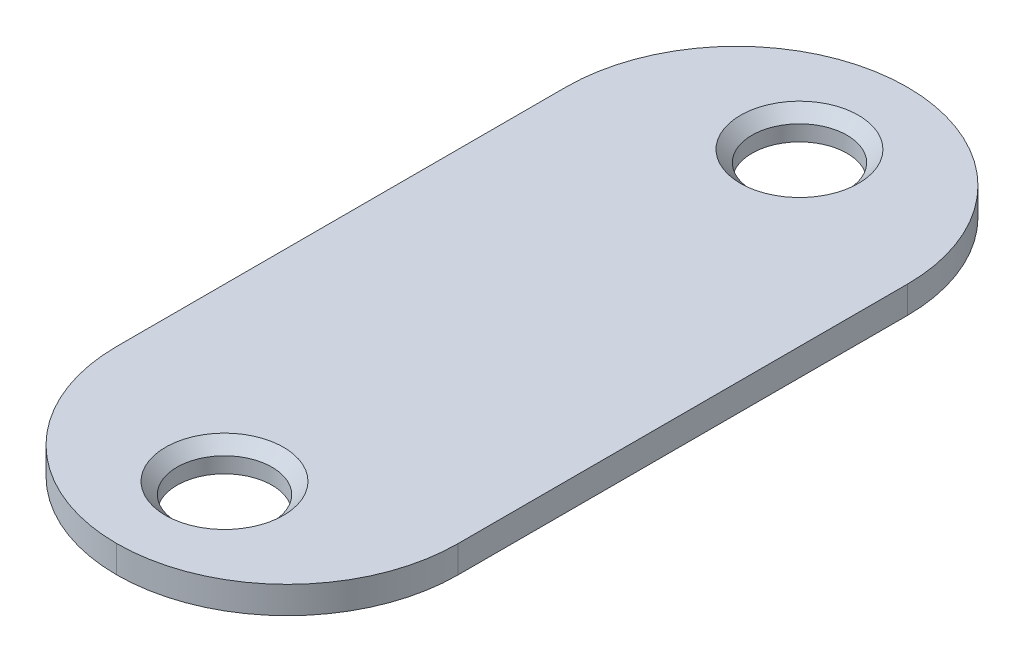
ISO-10303-21;
HEADER;
FILE_DESCRIPTION(('STEP AP214'),'2;1');
FILE_NAME('part.step','',(''),(''),'','','');
FILE_SCHEMA(('AUTOMOTIVE_DESIGN { 1 0 10303 214 1 1 1 1 }'));
ENDSEC;
DATA;
#1=APPLICATION_CONTEXT('core data for automotive mechanical design processes');
#2=APPLICATION_PROTOCOL_DEFINITION('international standard','automotive_design',2000,#1);
#3=PRODUCT_CONTEXT('',#1,'mechanical');
#4=PRODUCT('Part','Part','',(#3));
#5=PRODUCT_RELATED_PRODUCT_CATEGORY('part','',(#4));
#6=PRODUCT_DEFINITION_FORMATION('','',#4);
#7=PRODUCT_DEFINITION_CONTEXT('part definition',#1,'design');
#8=PRODUCT_DEFINITION('design','',#6,#7);
#9=PRODUCT_DEFINITION_SHAPE('','',#8);
#10=(LENGTH_UNIT() NAMED_UNIT(*) SI_UNIT(.MILLI.,.METRE.));
#11=(NAMED_UNIT(*) PLANE_ANGLE_UNIT() SI_UNIT($,.RADIAN.));
#12=(NAMED_UNIT(*) SI_UNIT($,.STERADIAN.) SOLID_ANGLE_UNIT());
#13=UNCERTAINTY_MEASURE_WITH_UNIT(LENGTH_MEASURE(1.E-05),#10,'distance_accuracy_value','');
#14=(GEOMETRIC_REPRESENTATION_CONTEXT(3) GLOBAL_UNCERTAINTY_ASSIGNED_CONTEXT((#13)) GLOBAL_UNIT_ASSIGNED_CONTEXT((#10,
#11,#12)) REPRESENTATION_CONTEXT('',''));
#15=CARTESIAN_POINT('',(0.,0.,0.));
#16=DIRECTION('',(0.,0.,1.));
#17=DIRECTION('',(1.,0.,0.));
#18=AXIS2_PLACEMENT_3D('',#15,#16,#17);
#19=CARTESIAN_POINT('',(-7.540625,1.2,-17.4625));
#20=DIRECTION('',(1.,0.,0.));
#21=DIRECTION('',(0.,0.,-1.));
#22=AXIS2_PLACEMENT_3D('',#19,#20,#21);
#23=PLANE('',#22);
#24=DIRECTION('',(0.,0.,1.));
#25=VECTOR('',#24,1.);
#26=CARTESIAN_POINT('',(-7.540625,0.,-17.4625));
#27=LINE('',#26,#25);
#28=CARTESIAN_POINT('',(-7.540625,0.,-9.921875));
#29=VERTEX_POINT('',#28);
#30=CARTESIAN_POINT('',(-7.540625,0.,9.921875));
#31=VERTEX_POINT('',#30);
#32=EDGE_CURVE('E96',#29,#31,#27,.T.);
#33=ORIENTED_EDGE('',*,*,#32,.T.);
#34=DIRECTION('',(0.,-1.,0.));
#35=VECTOR('',#34,1.);
#36=CARTESIAN_POINT('',(-7.540625,1.2,9.921875));
#37=LINE('',#36,#35);
#38=CARTESIAN_POINT('',(-7.540625,1.2,9.921875));
#39=VERTEX_POINT('',#38);
#40=EDGE_CURVE('E11',#31,#39,#37,.F.);
#41=ORIENTED_EDGE('',*,*,#40,.T.);
#42=DIRECTION('',(0.,0.,1.));
#43=VECTOR('',#42,1.);
#44=CARTESIAN_POINT('',(-7.540625,1.2,-17.4625));
#45=LINE('',#44,#43);
#46=CARTESIAN_POINT('',(-7.540625,1.2,-9.921875));
#47=VERTEX_POINT('',#46);
#48=EDGE_CURVE('E97',#47,#39,#45,.T.);
#49=ORIENTED_EDGE('',*,*,#48,.F.);
#50=DIRECTION('',(0.,-1.,0.));
#51=VECTOR('',#50,1.);
#52=CARTESIAN_POINT('',(-7.540625,1.2,-9.921875));
#53=LINE('',#52,#51);
#54=EDGE_CURVE('E90',#47,#29,#53,.T.);
#55=ORIENTED_EDGE('',*,*,#54,.T.);
#56=EDGE_LOOP('',(#33,#41,#49,#55));
#57=FACE_BOUND('',#56,.T.);
#58=ADVANCED_FACE('F31',(#57),#23,.F.);
#59=CARTESIAN_POINT('',(7.540625,1.2,-17.4625));
#60=DIRECTION('',(-1.,0.,0.));
#61=DIRECTION('',(0.,0.,1.));
#62=AXIS2_PLACEMENT_3D('',#59,#60,#61);
#63=PLANE('',#62);
#64=DIRECTION('',(0.,0.,-1.));
#65=VECTOR('',#64,1.);
#66=CARTESIAN_POINT('',(7.540625,1.2,-17.4625));
#67=LINE('',#66,#65);
#68=CARTESIAN_POINT('',(7.540625,1.2,9.921875));
#69=VERTEX_POINT('',#68);
#70=CARTESIAN_POINT('',(7.540625,1.2,-9.921875));
#71=VERTEX_POINT('',#70);
#72=EDGE_CURVE('E113',#69,#71,#67,.T.);
#73=ORIENTED_EDGE('',*,*,#72,.F.);
#74=DIRECTION('',(0.,-1.,0.));
#75=VECTOR('',#74,1.);
#76=CARTESIAN_POINT('',(7.540625,1.2,9.921875));
#77=LINE('',#76,#75);
#78=CARTESIAN_POINT('',(7.540625,0.,9.921875));
#79=VERTEX_POINT('',#78);
#80=EDGE_CURVE('E134',#69,#79,#77,.T.);
#81=ORIENTED_EDGE('',*,*,#80,.T.);
#82=DIRECTION('',(0.,0.,-1.));
#83=VECTOR('',#82,1.);
#84=CARTESIAN_POINT('',(7.540625,0.,-17.4625));
#85=LINE('',#84,#83);
#86=CARTESIAN_POINT('',(7.540625,0.,-9.921875));
#87=VERTEX_POINT('',#86);
#88=EDGE_CURVE('E104',#79,#87,#85,.T.);
#89=ORIENTED_EDGE('',*,*,#88,.T.);
#90=DIRECTION('',(0.,-1.,0.));
#91=VECTOR('',#90,1.);
#92=CARTESIAN_POINT('',(7.540625,1.2,-9.921875));
#93=LINE('',#92,#91);
#94=EDGE_CURVE('E132',#87,#71,#93,.F.);
#95=ORIENTED_EDGE('',*,*,#94,.T.);
#96=EDGE_LOOP('',(#73,#81,#89,#95));
#97=FACE_BOUND('',#96,.T.);
#98=ADVANCED_FACE('F154',(#97),#63,.F.);
#99=CARTESIAN_POINT('',(-7.540625,1.2,17.4625));
#100=DIRECTION('',(0.,1.,0.));
#101=DIRECTION('',(0.,0.,1.));
#102=AXIS2_PLACEMENT_3D('',#99,#100,#101);
#103=PLANE('',#102);
#104=CARTESIAN_POINT('',(0.,1.2,12.7));
#105=DIRECTION('',(0.,1.,0.));
#106=DIRECTION('',(0.,0.,1.));
#107=AXIS2_PLACEMENT_3D('',#104,#105,#106);
#108=CIRCLE('',#107,2.608);
#109=CARTESIAN_POINT('',(0.,1.2,15.308));
#110=VERTEX_POINT('',#109);
#111=EDGE_CURVE('E124',#110,#110,#108,.F.);
#112=ORIENTED_EDGE('',*,*,#111,.T.);
#113=EDGE_LOOP('',(#112));
#114=FACE_BOUND('',#113,.T.);
#115=CARTESIAN_POINT('',(0.,1.2,-12.7));
#116=DIRECTION('',(0.,1.,0.));
#117=DIRECTION('',(0.,0.,1.));
#118=AXIS2_PLACEMENT_3D('',#115,#116,#117);
#119=CIRCLE('',#118,2.608);
#120=CARTESIAN_POINT('',(0.,1.2,-10.092));
#121=VERTEX_POINT('',#120);
#122=EDGE_CURVE('E121',#121,#121,#119,.F.);
#123=ORIENTED_EDGE('',*,*,#122,.T.);
#124=EDGE_LOOP('',(#123));
#125=FACE_BOUND('',#124,.T.);
#126=CARTESIAN_POINT('',(0.,1.2,9.921875));
#127=DIRECTION('',(0.,1.,0.));
#128=DIRECTION('',(0.,0.,1.));
#129=AXIS2_PLACEMENT_3D('',#126,#127,#128);
#130=CIRCLE('',#129,7.540625);
#131=CARTESIAN_POINT('',(0.,1.2,17.4625));
#132=VERTEX_POINT('',#131);
#133=EDGE_CURVE('E47',#39,#132,#130,.T.);
#134=ORIENTED_EDGE('',*,*,#133,.T.);
#135=CARTESIAN_POINT('',(0.,1.2,9.921875));
#136=DIRECTION('',(0.,1.,0.));
#137=DIRECTION('',(0.,0.,1.));
#138=AXIS2_PLACEMENT_3D('',#135,#136,#137);
#139=CIRCLE('',#138,7.540625);
#140=EDGE_CURVE('E40',#132,#69,#139,.T.);
#141=ORIENTED_EDGE('',*,*,#140,.T.);
#142=ORIENTED_EDGE('',*,*,#72,.T.);
#143=CARTESIAN_POINT('',(0.,1.2,-9.921875));
#144=DIRECTION('',(0.,1.,0.));
#145=DIRECTION('',(0.,0.,1.));
#146=AXIS2_PLACEMENT_3D('',#143,#144,#145);
#147=CIRCLE('',#146,7.540625);
#148=CARTESIAN_POINT('',(0.,1.2,-17.4625));
#149=VERTEX_POINT('',#148);
#150=EDGE_CURVE('E142',#71,#149,#147,.T.);
#151=ORIENTED_EDGE('',*,*,#150,.T.);
#152=CARTESIAN_POINT('',(0.,1.2,-9.921875));
#153=DIRECTION('',(0.,1.,0.));
#154=DIRECTION('',(0.,0.,1.));
#155=AXIS2_PLACEMENT_3D('',#152,#153,#154);
#156=CIRCLE('',#155,7.540625);
#157=EDGE_CURVE('E130',#149,#47,#156,.T.);
#158=ORIENTED_EDGE('',*,*,#157,.T.);
#159=ORIENTED_EDGE('',*,*,#48,.T.);
#160=EDGE_LOOP('',(#134,#141,#142,#151,#158,#159));
#161=FACE_BOUND('',#160,.T.);
#162=ADVANCED_FACE('F148',(#114,#125,#161),#103,.T.);
#163=CARTESIAN_POINT('',(-7.540625,0.,17.4625));
#164=DIRECTION('',(0.,1.,0.));
#165=DIRECTION('',(0.,0.,1.));
#166=AXIS2_PLACEMENT_3D('',#163,#164,#165);
#167=PLANE('',#166);
#168=CARTESIAN_POINT('',(0.,0.,12.7));
#169=DIRECTION('',(0.,1.,0.));
#170=DIRECTION('',(0.,0.,1.));
#171=AXIS2_PLACEMENT_3D('',#168,#169,#170);
#172=CIRCLE('',#171,2.1);
#173=CARTESIAN_POINT('',(0.,0.,14.8));
#174=VERTEX_POINT('',#173);
#175=EDGE_CURVE('E110',#174,#174,#172,.T.);
#176=ORIENTED_EDGE('',*,*,#175,.T.);
#177=EDGE_LOOP('',(#176));
#178=FACE_BOUND('',#177,.T.);
#179=CARTESIAN_POINT('',(0.,0.,-12.7));
#180=DIRECTION('',(0.,1.,0.));
#181=DIRECTION('',(0.,0.,1.));
#182=AXIS2_PLACEMENT_3D('',#179,#180,#181);
#183=CIRCLE('',#182,2.1);
#184=CARTESIAN_POINT('',(0.,0.,-10.6));
#185=VERTEX_POINT('',#184);
#186=EDGE_CURVE('E105',#185,#185,#183,.T.);
#187=ORIENTED_EDGE('',*,*,#186,.T.);
#188=EDGE_LOOP('',(#187));
#189=FACE_BOUND('',#188,.T.);
#190=ORIENTED_EDGE('',*,*,#88,.F.);
#191=CARTESIAN_POINT('',(0.,0.,9.921875));
#192=DIRECTION('',(0.,1.,0.));
#193=DIRECTION('',(0.,0.,1.));
#194=AXIS2_PLACEMENT_3D('',#191,#192,#193);
#195=CIRCLE('',#194,7.540625);
#196=CARTESIAN_POINT('',(0.,0.,17.4625));
#197=VERTEX_POINT('',#196);
#198=EDGE_CURVE('E140',#79,#197,#195,.F.);
#199=ORIENTED_EDGE('',*,*,#198,.T.);
#200=CARTESIAN_POINT('',(0.,0.,9.921875));
#201=DIRECTION('',(0.,1.,0.));
#202=DIRECTION('',(0.,0.,1.));
#203=AXIS2_PLACEMENT_3D('',#200,#201,#202);
#204=CIRCLE('',#203,7.540625);
#205=EDGE_CURVE('E103',#197,#31,#204,.F.);
#206=ORIENTED_EDGE('',*,*,#205,.T.);
#207=ORIENTED_EDGE('',*,*,#32,.F.);
#208=CARTESIAN_POINT('',(0.,0.,-9.921875));
#209=DIRECTION('',(0.,1.,0.));
#210=DIRECTION('',(0.,0.,1.));
#211=AXIS2_PLACEMENT_3D('',#208,#209,#210);
#212=CIRCLE('',#211,7.540625);
#213=CARTESIAN_POINT('',(0.,0.,-17.4625));
#214=VERTEX_POINT('',#213);
#215=EDGE_CURVE('E86',#29,#214,#212,.F.);
#216=ORIENTED_EDGE('',*,*,#215,.T.);
#217=CARTESIAN_POINT('',(0.,0.,-9.921875));
#218=DIRECTION('',(0.,1.,0.));
#219=DIRECTION('',(0.,0.,1.));
#220=AXIS2_PLACEMENT_3D('',#217,#218,#219);
#221=CIRCLE('',#220,7.540625);
#222=EDGE_CURVE('E137',#214,#87,#221,.F.);
#223=ORIENTED_EDGE('',*,*,#222,.T.);
#224=EDGE_LOOP('',(#190,#199,#206,#207,#216,#223));
#225=FACE_BOUND('',#224,.T.);
#226=ADVANCED_FACE('F101',(#178,#189,#225),#167,.F.);
#227=CARTESIAN_POINT('',(0.,-0.784375,-12.7));
#228=DIRECTION('',(0.,1.,0.));
#229=DIRECTION('',(0.,0.,1.));
#230=AXIS2_PLACEMENT_3D('',#227,#228,#229);
#231=CYLINDRICAL_SURFACE('',#230,2.1);
#232=CARTESIAN_POINT('',(0.,0.692000000000001,-12.7));
#233=DIRECTION('',(0.,1.,0.));
#234=DIRECTION('',(0.,0.,1.));
#235=AXIS2_PLACEMENT_3D('',#232,#233,#234);
#236=CIRCLE('',#235,2.1);
#237=CARTESIAN_POINT('',(0.,0.692000000000001,-10.6));
#238=VERTEX_POINT('',#237);
#239=EDGE_CURVE('E98',#238,#238,#236,.T.);
#240=ORIENTED_EDGE('',*,*,#239,.T.);
#241=EDGE_LOOP('',(#240));
#242=FACE_BOUND('',#241,.T.);
#243=ORIENTED_EDGE('',*,*,#186,.F.);
#244=EDGE_LOOP('',(#243));
#245=FACE_BOUND('',#244,.T.);
#246=ADVANCED_FACE('F188',(#242,#245),#231,.F.);
#247=CARTESIAN_POINT('',(0.,-0.784375,12.7));
#248=DIRECTION('',(0.,1.,0.));
#249=DIRECTION('',(0.,0.,1.));
#250=AXIS2_PLACEMENT_3D('',#247,#248,#249);
#251=CYLINDRICAL_SURFACE('',#250,2.1);
#252=CARTESIAN_POINT('',(0.,0.692000000000001,12.7));
#253=DIRECTION('',(0.,1.,0.));
#254=DIRECTION('',(0.,0.,1.));
#255=AXIS2_PLACEMENT_3D('',#252,#253,#254);
#256=CIRCLE('',#255,2.1);
#257=CARTESIAN_POINT('',(0.,0.692000000000001,14.8));
#258=VERTEX_POINT('',#257);
#259=EDGE_CURVE('E118',#258,#258,#256,.T.);
#260=ORIENTED_EDGE('',*,*,#259,.T.);
#261=EDGE_LOOP('',(#260));
#262=FACE_BOUND('',#261,.T.);
#263=ORIENTED_EDGE('',*,*,#175,.F.);
#264=EDGE_LOOP('',(#263));
#265=FACE_BOUND('',#264,.T.);
#266=ADVANCED_FACE('F179',(#262,#265),#251,.F.);
#267=CARTESIAN_POINT('',(0.,0.692000000000001,12.7));
#268=DIRECTION('',(0.,1.,0.));
#269=DIRECTION('',(0.,0.,1.));
#270=AXIS2_PLACEMENT_3D('',#267,#268,#269);
#271=CONICAL_SURFACE('',#270,2.1,0.785398163397448);
#272=ORIENTED_EDGE('',*,*,#111,.F.);
#273=EDGE_LOOP('',(#272));
#274=FACE_BOUND('',#273,.T.);
#275=ORIENTED_EDGE('',*,*,#259,.F.);
#276=EDGE_LOOP('',(#275));
#277=FACE_BOUND('',#276,.T.);
#278=ADVANCED_FACE('F176',(#274,#277),#271,.F.);
#279=CARTESIAN_POINT('',(0.,0.692000000000001,-12.7));
#280=DIRECTION('',(0.,1.,0.));
#281=DIRECTION('',(0.,0.,1.));
#282=AXIS2_PLACEMENT_3D('',#279,#280,#281);
#283=CONICAL_SURFACE('',#282,2.1,0.785398163397448);
#284=ORIENTED_EDGE('',*,*,#122,.F.);
#285=EDGE_LOOP('',(#284));
#286=FACE_BOUND('',#285,.T.);
#287=ORIENTED_EDGE('',*,*,#239,.F.);
#288=EDGE_LOOP('',(#287));
#289=FACE_BOUND('',#288,.T.);
#290=ADVANCED_FACE('F165',(#286,#289),#283,.F.);
#291=CARTESIAN_POINT('',(0.,1.2,-9.921875));
#292=DIRECTION('',(0.,-1.,0.));
#293=DIRECTION('',(0.,0.,-1.));
#294=AXIS2_PLACEMENT_3D('',#291,#292,#293);
#295=CYLINDRICAL_SURFACE('',#294,7.540625);
#296=ORIENTED_EDGE('',*,*,#157,.F.);
#297=DIRECTION('',(0.,-1.,0.));
#298=VECTOR('',#297,1.);
#299=CARTESIAN_POINT('',(0.,1.2,-17.4625));
#300=LINE('',#299,#298);
#301=EDGE_CURVE('E92',#214,#149,#300,.F.);
#302=ORIENTED_EDGE('',*,*,#301,.F.);
#303=ORIENTED_EDGE('',*,*,#215,.F.);
#304=ORIENTED_EDGE('',*,*,#54,.F.);
#305=EDGE_LOOP('',(#296,#302,#303,#304));
#306=FACE_BOUND('',#305,.T.);
#307=ADVANCED_FACE('F89',(#306),#295,.T.);
#308=CARTESIAN_POINT('',(0.,1.2,9.921875));
#309=DIRECTION('',(0.,-1.,0.));
#310=DIRECTION('',(0.,0.,-1.));
#311=AXIS2_PLACEMENT_3D('',#308,#309,#310);
#312=CYLINDRICAL_SURFACE('',#311,7.540625);
#313=DIRECTION('',(0.,-1.,0.));
#314=VECTOR('',#313,1.);
#315=CARTESIAN_POINT('',(0.,1.2,17.4625));
#316=LINE('',#315,#314);
#317=EDGE_CURVE('E35',#132,#197,#316,.T.);
#318=ORIENTED_EDGE('',*,*,#317,.F.);
#319=ORIENTED_EDGE('',*,*,#133,.F.);
#320=ORIENTED_EDGE('',*,*,#40,.F.);
#321=ORIENTED_EDGE('',*,*,#205,.F.);
#322=EDGE_LOOP('',(#318,#319,#320,#321));
#323=FACE_BOUND('',#322,.T.);
#324=ADVANCED_FACE('F158',(#323),#312,.T.);
#325=CARTESIAN_POINT('',(0.,1.2,9.921875));
#326=DIRECTION('',(0.,-1.,0.));
#327=DIRECTION('',(0.,0.,-1.));
#328=AXIS2_PLACEMENT_3D('',#325,#326,#327);
#329=CYLINDRICAL_SURFACE('',#328,7.540625);
#330=ORIENTED_EDGE('',*,*,#140,.F.);
#331=ORIENTED_EDGE('',*,*,#317,.T.);
#332=ORIENTED_EDGE('',*,*,#198,.F.);
#333=ORIENTED_EDGE('',*,*,#80,.F.);
#334=EDGE_LOOP('',(#330,#331,#332,#333));
#335=FACE_BOUND('',#334,.T.);
#336=ADVANCED_FACE('F156',(#335),#329,.T.);
#337=CARTESIAN_POINT('',(0.,1.2,-9.921875));
#338=DIRECTION('',(0.,-1.,0.));
#339=DIRECTION('',(0.,0.,-1.));
#340=AXIS2_PLACEMENT_3D('',#337,#338,#339);
#341=CYLINDRICAL_SURFACE('',#340,7.540625);
#342=ORIENTED_EDGE('',*,*,#150,.F.);
#343=ORIENTED_EDGE('',*,*,#94,.F.);
#344=ORIENTED_EDGE('',*,*,#222,.F.);
#345=ORIENTED_EDGE('',*,*,#301,.T.);
#346=EDGE_LOOP('',(#342,#343,#344,#345));
#347=FACE_BOUND('',#346,.T.);
#348=ADVANCED_FACE('F33',(#347),#341,.T.);
#349=CLOSED_SHELL('',(#58,#98,#162,#226,#246,#266,#278,#290,#307,#324,#336,#348));
#350=MANIFOLD_SOLID_BREP('B2',#349);
#351=ADVANCED_BREP_SHAPE_REPRESENTATION('',(#18,#350),#14);
#352=SHAPE_DEFINITION_REPRESENTATION(#9,#351);
ENDSEC;
END-ISO-10303-21;
